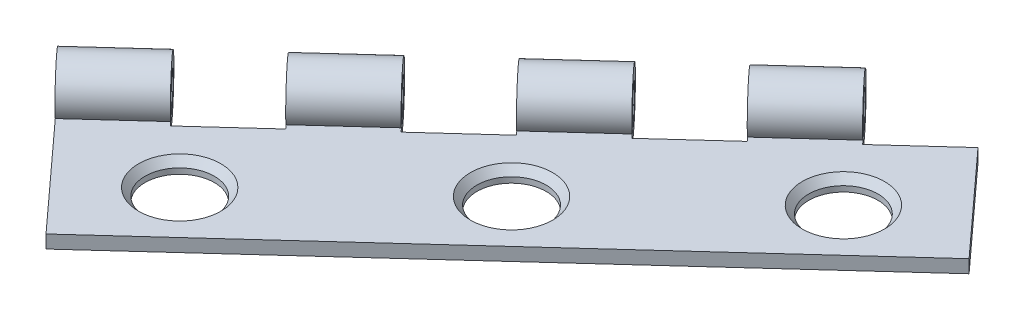
ISO-10303-21;
HEADER;
FILE_DESCRIPTION(('STEP AP214'),'2;1');
FILE_NAME('part.step','',(''),(''),'','','');
FILE_SCHEMA(('AUTOMOTIVE_DESIGN { 1 0 10303 214 1 1 1 1 }'));
ENDSEC;
DATA;
#1=APPLICATION_CONTEXT('core data for automotive mechanical design processes');
#2=APPLICATION_PROTOCOL_DEFINITION('international standard','automotive_design',2000,#1);
#3=PRODUCT_CONTEXT('',#1,'mechanical');
#4=PRODUCT('Part','Part','',(#3));
#5=PRODUCT_RELATED_PRODUCT_CATEGORY('part','',(#4));
#6=PRODUCT_DEFINITION_FORMATION('','',#4);
#7=PRODUCT_DEFINITION_CONTEXT('part definition',#1,'design');
#8=PRODUCT_DEFINITION('design','',#6,#7);
#9=PRODUCT_DEFINITION_SHAPE('','',#8);
#10=(LENGTH_UNIT() NAMED_UNIT(*) SI_UNIT(.MILLI.,.METRE.));
#11=(NAMED_UNIT(*) PLANE_ANGLE_UNIT() SI_UNIT($,.RADIAN.));
#12=(NAMED_UNIT(*) SI_UNIT($,.STERADIAN.) SOLID_ANGLE_UNIT());
#13=UNCERTAINTY_MEASURE_WITH_UNIT(LENGTH_MEASURE(1.E-05),#10,'distance_accuracy_value','');
#14=(GEOMETRIC_REPRESENTATION_CONTEXT(3) GLOBAL_UNCERTAINTY_ASSIGNED_CONTEXT((#13)) GLOBAL_UNIT_ASSIGNED_CONTEXT((#10,
#11,#12)) REPRESENTATION_CONTEXT('',''));
#15=CARTESIAN_POINT('',(0.,0.,0.));
#16=DIRECTION('',(0.,0.,1.));
#17=DIRECTION('',(1.,0.,0.));
#18=AXIS2_PLACEMENT_3D('',#15,#16,#17);
#19=CARTESIAN_POINT('',(-91.6637022397042,14.8082,-282.552746295608));
#20=DIRECTION('',(-0.739139866909712,0.,0.673551970633813));
#21=DIRECTION('',(0.673551970633813,0.,0.739139866909712));
#22=AXIS2_PLACEMENT_3D('',#19,#20,#21);
#23=CYLINDRICAL_SURFACE('',#22,1.0922);
#24=DIRECTION('',(-0.739139866909712,0.,0.673551970633813));
#25=VECTOR('',#24,1.);
#26=CARTESIAN_POINT('',(-91.0105034738831,14.3057826741851,-281.835941550192));
#27=LINE('',#26,#25);
#28=CARTESIAN_POINT('',(-105.091117938513,14.3057826741851,-269.004776509618));
#29=VERTEX_POINT('',#28);
#30=CARTESIAN_POINT('',(-109.78465609339,14.3057826741851,-264.727721496093));
#31=VERTEX_POINT('',#30);
#32=EDGE_CURVE('E384',#29,#31,#27,.T.);
#33=ORIENTED_EDGE('',*,*,#32,.T.);
#34=CARTESIAN_POINT('',(-110.437854859211,14.8082,-265.444526241509));
#35=DIRECTION('',(0.739139866909712,0.,-0.673551970633813));
#36=DIRECTION('',(-0.673551970633813,0.,-0.739139866909712));
#37=AXIS2_PLACEMENT_3D('',#34,#35,#36);
#38=CIRCLE('',#37,1.0922);
#39=CARTESIAN_POINT('',(-110.437854859211,13.716,-265.444526241509));
#40=VERTEX_POINT('',#39);
#41=EDGE_CURVE('E316',#31,#40,#38,.F.);
#42=ORIENTED_EDGE('',*,*,#41,.T.);
#43=DIRECTION('',(-0.739139866909712,0.,0.673551970633813));
#44=VECTOR('',#43,1.);
#45=CARTESIAN_POINT('',(-91.6637022397042,13.716,-282.552746295608));
#46=LINE('',#45,#44);
#47=CARTESIAN_POINT('',(-105.744316704334,13.716,-269.721581255034));
#48=VERTEX_POINT('',#47);
#49=EDGE_CURVE('E403',#48,#40,#46,.T.);
#50=ORIENTED_EDGE('',*,*,#49,.F.);
#51=CARTESIAN_POINT('',(-105.744316704334,14.8082,-269.721581255034));
#52=DIRECTION('',(-0.739139866909712,0.,0.673551970633813));
#53=DIRECTION('',(0.673551970633813,0.,0.739139866909712));
#54=AXIS2_PLACEMENT_3D('',#51,#52,#53);
#55=CIRCLE('',#54,1.0922);
#56=EDGE_CURVE('E280',#48,#29,#55,.F.);
#57=ORIENTED_EDGE('',*,*,#56,.T.);
#58=EDGE_LOOP('',(#33,#42,#50,#57));
#59=FACE_BOUND('',#58,.T.);
#60=ADVANCED_FACE('F41',(#59),#23,.F.);
#61=CARTESIAN_POINT('',(-95.7040416287597,14.3057826741851,-277.558886536667));
#62=VERTEX_POINT('',#61);
#63=CARTESIAN_POINT('',(-100.397579783636,14.3057826741851,-273.281831523143));
#64=VERTEX_POINT('',#63);
#65=EDGE_CURVE('E482',#62,#64,#27,.T.);
#66=ORIENTED_EDGE('',*,*,#65,.T.);
#67=CARTESIAN_POINT('',(-101.050778549457,14.8082,-273.998636268559));
#68=DIRECTION('',(0.739139866909712,0.,-0.673551970633813));
#69=DIRECTION('',(-0.673551970633813,0.,-0.739139866909712));
#70=AXIS2_PLACEMENT_3D('',#67,#68,#69);
#71=CIRCLE('',#70,1.0922);
#72=CARTESIAN_POINT('',(-101.050778549457,13.716,-273.998636268559));
#73=VERTEX_POINT('',#72);
#74=EDGE_CURVE('E294',#64,#73,#71,.F.);
#75=ORIENTED_EDGE('',*,*,#74,.T.);
#76=CARTESIAN_POINT('',(-96.3572403945808,13.716,-278.275691282083));
#77=VERTEX_POINT('',#76);
#78=EDGE_CURVE('E408',#77,#73,#46,.T.);
#79=ORIENTED_EDGE('',*,*,#78,.F.);
#80=CARTESIAN_POINT('',(-96.3572403945808,14.8082,-278.275691282083));
#81=DIRECTION('',(-0.739139866909712,0.,0.673551970633813));
#82=DIRECTION('',(0.673551970633813,0.,0.739139866909712));
#83=AXIS2_PLACEMENT_3D('',#80,#81,#82);
#84=CIRCLE('',#83,1.0922);
#85=EDGE_CURVE('E269',#77,#62,#84,.F.);
#86=ORIENTED_EDGE('',*,*,#85,.T.);
#87=EDGE_LOOP('',(#66,#75,#79,#86));
#88=FACE_BOUND('',#87,.T.);
#89=ADVANCED_FACE('F508',(#88),#23,.F.);
#90=CARTESIAN_POINT('',(-91.6637022397042,14.8082000000001,-282.552746295608));
#91=DIRECTION('',(-0.739139866909712,0.,0.673551970633813));
#92=DIRECTION('',(0.673551970633813,0.,0.739139866909712));
#93=AXIS2_PLACEMENT_3D('',#90,#91,#92);
#94=CYLINDRICAL_SURFACE('',#93,2.10820000000008);
#95=CARTESIAN_POINT('',(-110.437854859211,14.8082000000001,-265.444526241509));
#96=DIRECTION('',(0.739139866909712,0.,-0.673551970633813));
#97=DIRECTION('',(-0.673551970633813,0.,-0.739139866909712));
#98=AXIS2_PLACEMENT_3D('',#95,#96,#97);
#99=CIRCLE('',#98,2.10820000000008);
#100=CARTESIAN_POINT('',(-110.437854859211,12.7,-265.444526241509));
#101=VERTEX_POINT('',#100);
#102=CARTESIAN_POINT('',(-109.177029334486,13.8384177199387,-264.060926384078));
#103=VERTEX_POINT('',#102);
#104=EDGE_CURVE('E230',#101,#103,#99,.T.);
#105=ORIENTED_EDGE('',*,*,#104,.T.);
#106=DIRECTION('',(-0.739139866909712,0.,0.673551970633813));
#107=VECTOR('',#106,1.);
#108=CARTESIAN_POINT('',(-90.4028767149797,13.8384177199387,-281.169146438177));
#109=LINE('',#108,#107);
#110=CARTESIAN_POINT('',(-104.48349117961,13.8384177199387,-268.337981397603));
#111=VERTEX_POINT('',#110);
#112=EDGE_CURVE('E387',#111,#103,#109,.T.);
#113=ORIENTED_EDGE('',*,*,#112,.F.);
#114=CARTESIAN_POINT('',(-105.744316704334,14.8082000000001,-269.721581255034));
#115=DIRECTION('',(-0.739139866909712,0.,0.673551970633813));
#116=DIRECTION('',(0.673551970633813,0.,0.739139866909712));
#117=AXIS2_PLACEMENT_3D('',#114,#115,#116);
#118=CIRCLE('',#117,2.10820000000008);
#119=CARTESIAN_POINT('',(-105.744316704334,12.7,-269.721581255034));
#120=VERTEX_POINT('',#119);
#121=EDGE_CURVE('E286',#111,#120,#118,.T.);
#122=ORIENTED_EDGE('',*,*,#121,.T.);
#123=DIRECTION('',(-0.739139866909712,0.,0.673551970633813));
#124=VECTOR('',#123,1.);
#125=CARTESIAN_POINT('',(-91.6637022397042,12.7,-282.552746295608));
#126=LINE('',#125,#124);
#127=EDGE_CURVE('E391',#120,#101,#126,.T.);
#128=ORIENTED_EDGE('',*,*,#127,.T.);
#129=EDGE_LOOP('',(#105,#113,#122,#128));
#130=FACE_BOUND('',#129,.T.);
#131=ADVANCED_FACE('F526',(#130),#94,.T.);
#132=CARTESIAN_POINT('',(-101.050778549457,14.8082000000001,-273.998636268559));
#133=DIRECTION('',(0.739139866909712,0.,-0.673551970633813));
#134=DIRECTION('',(-0.673551970633813,0.,-0.739139866909712));
#135=AXIS2_PLACEMENT_3D('',#132,#133,#134);
#136=CIRCLE('',#135,2.10820000000008);
#137=CARTESIAN_POINT('',(-101.050778549457,12.7,-273.998636268559));
#138=VERTEX_POINT('',#137);
#139=CARTESIAN_POINT('',(-99.789953024733,13.8384177199387,-272.615036411128));
#140=VERTEX_POINT('',#139);
#141=EDGE_CURVE('E300',#138,#140,#136,.T.);
#142=ORIENTED_EDGE('',*,*,#141,.T.);
#143=CARTESIAN_POINT('',(-95.0964148698564,13.8384177199387,-276.892091424652));
#144=VERTEX_POINT('',#143);
#145=EDGE_CURVE('E490',#144,#140,#109,.T.);
#146=ORIENTED_EDGE('',*,*,#145,.F.);
#147=CARTESIAN_POINT('',(-96.3572403945808,14.8082000000001,-278.275691282083));
#148=DIRECTION('',(-0.739139866909712,0.,0.673551970633813));
#149=DIRECTION('',(0.673551970633813,0.,0.739139866909712));
#150=AXIS2_PLACEMENT_3D('',#147,#148,#149);
#151=CIRCLE('',#150,2.10820000000008);
#152=CARTESIAN_POINT('',(-96.3572403945808,12.7,-278.275691282083));
#153=VERTEX_POINT('',#152);
#154=EDGE_CURVE('E275',#144,#153,#151,.T.);
#155=ORIENTED_EDGE('',*,*,#154,.T.);
#156=EDGE_CURVE('E397',#153,#138,#126,.T.);
#157=ORIENTED_EDGE('',*,*,#156,.T.);
#158=EDGE_LOOP('',(#142,#146,#155,#157));
#159=FACE_BOUND('',#158,.T.);
#160=ADVANCED_FACE('F528',(#159),#94,.T.);
#161=CARTESIAN_POINT('',(-113.870567489363,13.8384177199387,-259.783871370554));
#162=VERTEX_POINT('',#161);
#163=CARTESIAN_POINT('',(-118.56410564424,13.8384177199387,-255.506816357029));
#164=VERTEX_POINT('',#163);
#165=EDGE_CURVE('E385',#162,#164,#109,.T.);
#166=ORIENTED_EDGE('',*,*,#165,.F.);
#167=CARTESIAN_POINT('',(-115.131393014087,14.8082000000001,-261.167471227984));
#168=DIRECTION('',(-0.739139866909712,0.,0.673551970633813));
#169=DIRECTION('',(0.673551970633813,0.,0.739139866909712));
#170=AXIS2_PLACEMENT_3D('',#167,#168,#169);
#171=CIRCLE('',#170,2.10820000000008);
#172=CARTESIAN_POINT('',(-115.131393014087,12.7,-261.167471227984));
#173=VERTEX_POINT('',#172);
#174=EDGE_CURVE('E311',#162,#173,#171,.T.);
#175=ORIENTED_EDGE('',*,*,#174,.T.);
#176=CARTESIAN_POINT('',(-119.824931168964,12.7,-256.89041621446));
#177=VERTEX_POINT('',#176);
#178=EDGE_CURVE('E389',#173,#177,#126,.T.);
#179=ORIENTED_EDGE('',*,*,#178,.T.);
#180=CARTESIAN_POINT('',(-119.824931168964,14.8082000000001,-256.89041621446));
#181=DIRECTION('',(0.739139866909712,0.,-0.673551970633813));
#182=DIRECTION('',(-0.673551970633813,0.,-0.739139866909712));
#183=AXIS2_PLACEMENT_3D('',#180,#181,#182);
#184=CIRCLE('',#183,2.10820000000008);
#185=EDGE_CURVE('E347',#177,#164,#184,.T.);
#186=ORIENTED_EDGE('',*,*,#185,.T.);
#187=EDGE_LOOP('',(#166,#175,#179,#186));
#188=FACE_BOUND('',#187,.T.);
#189=ADVANCED_FACE('F578',(#188),#94,.T.);
#190=CARTESIAN_POINT('',(-91.0105034738831,14.3057826741851,-281.835941550192));
#191=DIRECTION('',(0.309837190883727,0.887916388995925,0.340007942992099));
#192=DIRECTION('',(0.598057833566265,-0.460004876226804,0.6562944015894));
#193=AXIS2_PLACEMENT_3D('',#190,#191,#192);
#194=PLANE('',#193);
#195=ORIENTED_EDGE('',*,*,#112,.T.);
#196=DIRECTION('',(-0.598057833566265,0.460004876226804,-0.6562944015894));
#197=VECTOR('',#196,1.);
#198=CARTESIAN_POINT('',(-109.78465609339,14.3057826741851,-264.727721496093));
#199=LINE('',#198,#197);
#200=EDGE_CURVE('E319',#103,#31,#199,.T.);
#201=ORIENTED_EDGE('',*,*,#200,.T.);
#202=ORIENTED_EDGE('',*,*,#32,.F.);
#203=DIRECTION('',(0.598057833566265,-0.460004876226804,0.6562944015894));
#204=VECTOR('',#203,1.);
#205=CARTESIAN_POINT('',(-105.091117938513,14.3057826741851,-269.004776509618));
#206=LINE('',#205,#204);
#207=EDGE_CURVE('E283',#29,#111,#206,.T.);
#208=ORIENTED_EDGE('',*,*,#207,.T.);
#209=EDGE_LOOP('',(#195,#201,#202,#208));
#210=FACE_BOUND('',#209,.T.);
#211=ADVANCED_FACE('F523',(#210),#194,.F.);
#212=ORIENTED_EDGE('',*,*,#145,.T.);
#213=DIRECTION('',(-0.598057833566265,0.460004876226804,-0.6562944015894));
#214=VECTOR('',#213,1.);
#215=CARTESIAN_POINT('',(-100.397579783636,14.3057826741851,-273.281831523143));
#216=LINE('',#215,#214);
#217=EDGE_CURVE('E297',#140,#64,#216,.T.);
#218=ORIENTED_EDGE('',*,*,#217,.T.);
#219=ORIENTED_EDGE('',*,*,#65,.F.);
#220=DIRECTION('',(0.598057833566265,-0.460004876226804,0.6562944015894));
#221=VECTOR('',#220,1.);
#222=CARTESIAN_POINT('',(-95.7040416287597,14.3057826741851,-277.558886536667));
#223=LINE('',#222,#221);
#224=EDGE_CURVE('E272',#62,#144,#223,.T.);
#225=ORIENTED_EDGE('',*,*,#224,.T.);
#226=EDGE_LOOP('',(#212,#218,#219,#225));
#227=FACE_BOUND('',#226,.T.);
#228=ADVANCED_FACE('F516',(#227),#194,.F.);
#229=CARTESIAN_POINT('',(-115.131393014087,13.716,-261.167471227984));
#230=VERTEX_POINT('',#229);
#231=CARTESIAN_POINT('',(-119.824931168964,13.716,-256.89041621446));
#232=VERTEX_POINT('',#231);
#233=EDGE_CURVE('E401',#230,#232,#46,.T.);
#234=ORIENTED_EDGE('',*,*,#233,.F.);
#235=CARTESIAN_POINT('',(-115.131393014087,14.8082,-261.167471227984));
#236=DIRECTION('',(-0.739139866909712,0.,0.673551970633813));
#237=DIRECTION('',(0.673551970633813,0.,0.739139866909712));
#238=AXIS2_PLACEMENT_3D('',#235,#236,#237);
#239=CIRCLE('',#238,1.0922);
#240=CARTESIAN_POINT('',(-114.478194248266,14.3057826741851,-260.450666482568));
#241=VERTEX_POINT('',#240);
#242=EDGE_CURVE('E305',#230,#241,#239,.F.);
#243=ORIENTED_EDGE('',*,*,#242,.T.);
#244=CARTESIAN_POINT('',(-119.171732403143,14.3057826741851,-256.173611469044));
#245=VERTEX_POINT('',#244);
#246=EDGE_CURVE('E382',#241,#245,#27,.T.);
#247=ORIENTED_EDGE('',*,*,#246,.T.);
#248=CARTESIAN_POINT('',(-119.824931168964,14.8082,-256.89041621446));
#249=DIRECTION('',(0.739139866909712,0.,-0.673551970633813));
#250=DIRECTION('',(-0.673551970633813,0.,-0.739139866909712));
#251=AXIS2_PLACEMENT_3D('',#248,#249,#250);
#252=CIRCLE('',#251,1.0922);
#253=EDGE_CURVE('E346',#245,#232,#252,.F.);
#254=ORIENTED_EDGE('',*,*,#253,.T.);
#255=EDGE_LOOP('',(#234,#243,#247,#254));
#256=FACE_BOUND('',#255,.T.);
#257=ADVANCED_FACE('F547',(#256),#23,.F.);
#258=ORIENTED_EDGE('',*,*,#246,.F.);
#259=DIRECTION('',(0.598057833566265,-0.460004876226804,0.6562944015894));
#260=VECTOR('',#259,1.);
#261=CARTESIAN_POINT('',(-114.478194248266,14.3057826741851,-260.450666482568));
#262=LINE('',#261,#260);
#263=EDGE_CURVE('E308',#241,#162,#262,.T.);
#264=ORIENTED_EDGE('',*,*,#263,.T.);
#265=ORIENTED_EDGE('',*,*,#165,.T.);
#266=DIRECTION('',(-0.598057833566265,0.460004876226804,-0.6562944015894));
#267=VECTOR('',#266,1.);
#268=CARTESIAN_POINT('',(-119.171732403143,14.3057826741851,-256.173611469044));
#269=LINE('',#268,#267);
#270=EDGE_CURVE('E407',#164,#245,#269,.T.);
#271=ORIENTED_EDGE('',*,*,#270,.T.);
#272=EDGE_LOOP('',(#258,#264,#265,#271));
#273=FACE_BOUND('',#272,.T.);
#274=ADVANCED_FACE('F549',(#273),#194,.F.);
#275=CARTESIAN_POINT('',(-124.518469323841,13.716,-252.613361200935));
#276=VERTEX_POINT('',#275);
#277=CARTESIAN_POINT('',(-129.212007478718,13.716,-248.33630618741));
#278=VERTEX_POINT('',#277);
#279=EDGE_CURVE('E400',#276,#278,#46,.T.);
#280=ORIENTED_EDGE('',*,*,#279,.F.);
#281=CARTESIAN_POINT('',(-124.518469323841,14.8082,-252.613361200935));
#282=DIRECTION('',(-0.739139866909712,0.,0.673551970633813));
#283=DIRECTION('',(0.673551970633813,0.,0.739139866909712));
#284=AXIS2_PLACEMENT_3D('',#281,#282,#283);
#285=CIRCLE('',#284,1.0922);
#286=CARTESIAN_POINT('',(-123.86527055802,14.3057826741851,-251.896556455519));
#287=VERTEX_POINT('',#286);
#288=EDGE_CURVE('E336',#276,#287,#285,.F.);
#289=ORIENTED_EDGE('',*,*,#288,.T.);
#290=CARTESIAN_POINT('',(-128.558808712896,14.3057826741851,-247.619501441994));
#291=VERTEX_POINT('',#290);
#292=EDGE_CURVE('E367',#287,#291,#27,.T.);
#293=ORIENTED_EDGE('',*,*,#292,.T.);
#294=CARTESIAN_POINT('',(-129.212007478718,14.8082,-248.33630618741));
#295=DIRECTION('',(-0.739139866909712,0.,0.673551970633813));
#296=DIRECTION('',(0.673551970633813,0.,0.739139866909712));
#297=AXIS2_PLACEMENT_3D('',#294,#295,#296);
#298=CIRCLE('',#297,1.0922);
#299=EDGE_CURVE('E358',#291,#278,#298,.T.);
#300=ORIENTED_EDGE('',*,*,#299,.T.);
#301=EDGE_LOOP('',(#280,#289,#293,#300));
#302=FACE_BOUND('',#301,.T.);
#303=ADVANCED_FACE('F43',(#302),#23,.F.);
#304=CARTESIAN_POINT('',(-83.1095922126547,13.716,-273.165669985855));
#305=DIRECTION('',(0.,-1.,0.));
#306=DIRECTION('',(-0.673551970633813,0.,-0.739139866909712));
#307=AXIS2_PLACEMENT_3D('',#304,#305,#306);
#308=PLANE('',#307);
#309=CARTESIAN_POINT('',(-91.5929203588796,13.716,-271.87841376681));
#310=DIRECTION('',(0.,1.,0.));
#311=DIRECTION('',(0.673551970633813,0.,0.739139866909712));
#312=AXIS2_PLACEMENT_3D('',#309,#310,#311);
#313=CIRCLE('',#312,3.2004);
#314=CARTESIAN_POINT('',(-89.4372846320632,13.716,-269.512870536752));
#315=VERTEX_POINT('',#314);
#316=EDGE_CURVE('E256',#315,#315,#313,.T.);
#317=ORIENTED_EDGE('',*,*,#316,.F.);
#318=EDGE_LOOP('',(#317));
#319=FACE_BOUND('',#318,.T.);
#320=CARTESIAN_POINT('',(-105.091536092305,13.716,-259.577603547913));
#321=DIRECTION('',(0.,1.,0.));
#322=DIRECTION('',(0.673551970633813,0.,0.739139866909712));
#323=AXIS2_PLACEMENT_3D('',#320,#321,#322);
#324=CIRCLE('',#323,3.2004);
#325=CARTESIAN_POINT('',(-102.935900365488,13.716,-257.212060317855));
#326=VERTEX_POINT('',#325);
#327=EDGE_CURVE('E425',#326,#326,#324,.T.);
#328=ORIENTED_EDGE('',*,*,#327,.F.);
#329=EDGE_LOOP('',(#328));
#330=FACE_BOUND('',#329,.T.);
#331=CARTESIAN_POINT('',(-118.59015182573,13.716,-247.276793329016));
#332=DIRECTION('',(0.,1.,0.));
#333=DIRECTION('',(0.673551970633813,0.,0.739139866909712));
#334=AXIS2_PLACEMENT_3D('',#331,#332,#333);
#335=CIRCLE('',#334,3.2004);
#336=CARTESIAN_POINT('',(-116.434516098914,13.716,-244.911250098958));
#337=VERTEX_POINT('',#336);
#338=EDGE_CURVE('E421',#337,#337,#335,.T.);
#339=ORIENTED_EDGE('',*,*,#338,.F.);
#340=EDGE_LOOP('',(#339));
#341=FACE_BOUND('',#340,.T.);
#342=ORIENTED_EDGE('',*,*,#49,.T.);
#343=DIRECTION('',(0.673551970633813,0.,0.739139866909712));
#344=VECTOR('',#343,1.);
#345=CARTESIAN_POINT('',(-101.883744832161,13.716,-256.057449931756));
#346=LINE('',#345,#344);
#347=CARTESIAN_POINT('',(-109.017872594721,13.716,-263.88627157409));
#348=VERTEX_POINT('',#347);
#349=EDGE_CURVE('E314',#40,#348,#346,.T.);
#350=ORIENTED_EDGE('',*,*,#349,.T.);
#351=DIRECTION('',(-0.739139866909712,0.,0.673551970633813));
#352=VECTOR('',#351,1.);
#353=CARTESIAN_POINT('',(-90.2437199752138,13.716,-280.994491628189));
#354=LINE('',#353,#352);
#355=CARTESIAN_POINT('',(-113.711410749597,13.716,-259.609216560565));
#356=VERTEX_POINT('',#355);
#357=EDGE_CURVE('E220',#348,#356,#354,.T.);
#358=ORIENTED_EDGE('',*,*,#357,.T.);
#359=DIRECTION('',(-0.673551970633813,0.,-0.739139866909712));
#360=VECTOR('',#359,1.);
#361=CARTESIAN_POINT('',(-106.577282987038,13.716,-251.780394918231));
#362=LINE('',#361,#360);
#363=EDGE_CURVE('E302',#356,#230,#362,.T.);
#364=ORIENTED_EDGE('',*,*,#363,.T.);
#365=ORIENTED_EDGE('',*,*,#233,.T.);
#366=DIRECTION('',(0.673551970633813,0.,0.739139866909712));
#367=VECTOR('',#366,1.);
#368=CARTESIAN_POINT('',(-111.270821141915,13.716,-247.503339904706));
#369=LINE('',#368,#367);
#370=CARTESIAN_POINT('',(-118.404948904474,13.716,-255.33216154704));
#371=VERTEX_POINT('',#370);
#372=EDGE_CURVE('E350',#232,#371,#369,.T.);
#373=ORIENTED_EDGE('',*,*,#372,.T.);
#374=DIRECTION('',(-0.739139866909712,0.,0.673551970633813));
#375=VECTOR('',#374,1.);
#376=CARTESIAN_POINT('',(-90.2437199752138,13.716,-280.994491628189));
#377=LINE('',#376,#375);
#378=CARTESIAN_POINT('',(-123.098487059351,13.716,-251.055106533516));
#379=VERTEX_POINT('',#378);
#380=EDGE_CURVE('E355',#371,#379,#377,.T.);
#381=ORIENTED_EDGE('',*,*,#380,.T.);
#382=DIRECTION('',(-0.673551970633813,0.,-0.739139866909712));
#383=VECTOR('',#382,1.);
#384=CARTESIAN_POINT('',(-115.964359296791,13.716,-243.226284891182));
#385=LINE('',#384,#383);
#386=EDGE_CURVE('E341',#379,#276,#385,.T.);
#387=ORIENTED_EDGE('',*,*,#386,.T.);
#388=ORIENTED_EDGE('',*,*,#279,.T.);
#389=DIRECTION('',(0.673551970633813,0.,0.739139866909712));
#390=VECTOR('',#389,1.);
#391=CARTESIAN_POINT('',(-120.657897451668,13.716,-238.949229877657));
#392=LINE('',#391,#390);
#393=CARTESIAN_POINT('',(-120.657897451668,13.716,-238.949229877657));
#394=VERTEX_POINT('',#393);
#395=EDGE_CURVE('E370',#278,#394,#392,.T.);
#396=ORIENTED_EDGE('',*,*,#395,.T.);
#397=DIRECTION('',(-0.739139866909712,0.,0.673551970633813));
#398=VECTOR('',#397,1.);
#399=CARTESIAN_POINT('',(-83.1095922126547,13.716,-273.165669985855));
#400=LINE('',#399,#398);
#401=CARTESIAN_POINT('',(-83.1095922126547,13.716,-273.165669985855));
#402=VERTEX_POINT('',#401);
#403=EDGE_CURVE('E396',#402,#394,#400,.T.);
#404=ORIENTED_EDGE('',*,*,#403,.F.);
#405=DIRECTION('',(0.673551970633813,0.,0.739139866909712));
#406=VECTOR('',#405,1.);
#407=CARTESIAN_POINT('',(-83.1095922126547,13.716,-273.165669985855));
#408=LINE('',#407,#406);
#409=CARTESIAN_POINT('',(-90.2437199752138,13.716,-280.994491628189));
#410=VERTEX_POINT('',#409);
#411=EDGE_CURVE('E359',#410,#402,#408,.T.);
#412=ORIENTED_EDGE('',*,*,#411,.F.);
#413=DIRECTION('',(-0.739139866909712,0.,0.673551970633813));
#414=VECTOR('',#413,1.);
#415=CARTESIAN_POINT('',(-90.2437199752138,13.716,-280.994491628189));
#416=LINE('',#415,#414);
#417=CARTESIAN_POINT('',(-94.9372581300905,13.716,-276.717436614664));
#418=VERTEX_POINT('',#417);
#419=EDGE_CURVE('E223',#410,#418,#416,.T.);
#420=ORIENTED_EDGE('',*,*,#419,.T.);
#421=DIRECTION('',(-0.673551970633813,0.,-0.739139866909712));
#422=VECTOR('',#421,1.);
#423=CARTESIAN_POINT('',(-87.8031303675314,13.716,-268.88861497233));
#424=LINE('',#423,#422);
#425=EDGE_CURVE('E266',#418,#77,#424,.T.);
#426=ORIENTED_EDGE('',*,*,#425,.T.);
#427=ORIENTED_EDGE('',*,*,#78,.T.);
#428=DIRECTION('',(0.673551970633813,0.,0.739139866909712));
#429=VECTOR('',#428,1.);
#430=CARTESIAN_POINT('',(-92.4966685224081,13.716,-264.611559958805));
#431=LINE('',#430,#429);
#432=CARTESIAN_POINT('',(-99.6307962849672,13.716,-272.440381601139));
#433=VERTEX_POINT('',#432);
#434=EDGE_CURVE('E291',#73,#433,#431,.T.);
#435=ORIENTED_EDGE('',*,*,#434,.T.);
#436=DIRECTION('',(-0.739139866909712,0.,0.673551970633813));
#437=VECTOR('',#436,1.);
#438=CARTESIAN_POINT('',(-90.2437199752138,13.716,-280.994491628189));
#439=LINE('',#438,#437);
#440=CARTESIAN_POINT('',(-104.324334439844,13.716,-268.163326587615));
#441=VERTEX_POINT('',#440);
#442=EDGE_CURVE('E288',#433,#441,#439,.T.);
#443=ORIENTED_EDGE('',*,*,#442,.T.);
#444=DIRECTION('',(-0.673551970633813,0.,-0.739139866909712));
#445=VECTOR('',#444,1.);
#446=CARTESIAN_POINT('',(-97.1902066772847,13.716,-260.334504945281));
#447=LINE('',#446,#445);
#448=EDGE_CURVE('E277',#441,#48,#447,.T.);
#449=ORIENTED_EDGE('',*,*,#448,.T.);
#450=EDGE_LOOP('',(#342,#350,#358,#364,#365,#373,#381,#387,#388,#396,#404,#412,#420,#426,#427,
#435,#443,#449));
#451=FACE_BOUND('',#450,.T.);
#452=ADVANCED_FACE('F458',(#319,#330,#341,#451),#308,.F.);
#453=CARTESIAN_POINT('',(-83.1095922126547,12.7,-273.165669985855));
#454=DIRECTION('',(-0.673551970633813,0.,-0.739139866909712));
#455=DIRECTION('',(-0.739139866909712,0.,0.673551970633813));
#456=AXIS2_PLACEMENT_3D('',#453,#454,#455);
#457=PLANE('',#456);
#458=DIRECTION('',(0.,-1.,0.));
#459=VECTOR('',#458,1.);
#460=CARTESIAN_POINT('',(-120.657897451668,12.7,-238.949229877657));
#461=LINE('',#460,#459);
#462=CARTESIAN_POINT('',(-120.657897451668,12.7,-238.949229877657));
#463=VERTEX_POINT('',#462);
#464=EDGE_CURVE('E372',#394,#463,#461,.T.);
#465=ORIENTED_EDGE('',*,*,#464,.T.);
#466=DIRECTION('',(-0.739139866909712,0.,0.673551970633813));
#467=VECTOR('',#466,1.);
#468=CARTESIAN_POINT('',(-83.1095922126547,12.7,-273.165669985855));
#469=LINE('',#468,#467);
#470=CARTESIAN_POINT('',(-83.1095922126547,12.7,-273.165669985855));
#471=VERTEX_POINT('',#470);
#472=EDGE_CURVE('E393',#471,#463,#469,.T.);
#473=ORIENTED_EDGE('',*,*,#472,.F.);
#474=DIRECTION('',(0.,-1.,0.));
#475=VECTOR('',#474,1.);
#476=CARTESIAN_POINT('',(-83.1095922126547,12.7,-273.165669985855));
#477=LINE('',#476,#475);
#478=EDGE_CURVE('E361',#402,#471,#477,.T.);
#479=ORIENTED_EDGE('',*,*,#478,.F.);
#480=ORIENTED_EDGE('',*,*,#403,.T.);
#481=EDGE_LOOP('',(#465,#473,#479,#480));
#482=FACE_BOUND('',#481,.T.);
#483=ADVANCED_FACE('F461',(#482),#457,.F.);
#484=CARTESIAN_POINT('',(-91.6637022397042,12.7,-282.552746295608));
#485=DIRECTION('',(0.,1.,0.));
#486=DIRECTION('',(0.673551970633813,0.,0.739139866909712));
#487=AXIS2_PLACEMENT_3D('',#484,#485,#486);
#488=PLANE('',#487);
#489=CARTESIAN_POINT('',(-91.5929203588796,12.7,-271.87841376681));
#490=DIRECTION('',(0.,1.,0.));
#491=DIRECTION('',(0.673551970633813,0.,0.739139866909712));
#492=AXIS2_PLACEMENT_3D('',#489,#490,#491);
#493=CIRCLE('',#492,2.6924);
#494=CARTESIAN_POINT('',(-89.7794490331451,12.7,-269.888353589143));
#495=VERTEX_POINT('',#494);
#496=EDGE_CURVE('E416',#495,#495,#493,.T.);
#497=ORIENTED_EDGE('',*,*,#496,.T.);
#498=EDGE_LOOP('',(#497));
#499=FACE_BOUND('',#498,.T.);
#500=CARTESIAN_POINT('',(-105.091536092305,12.7,-259.577603547913));
#501=DIRECTION('',(0.,1.,0.));
#502=DIRECTION('',(0.673551970633813,0.,0.739139866909712));
#503=AXIS2_PLACEMENT_3D('',#500,#501,#502);
#504=CIRCLE('',#503,2.6924);
#505=CARTESIAN_POINT('',(-103.27806476657,12.7,-257.587543370246));
#506=VERTEX_POINT('',#505);
#507=EDGE_CURVE('E436',#506,#506,#504,.T.);
#508=ORIENTED_EDGE('',*,*,#507,.T.);
#509=EDGE_LOOP('',(#508));
#510=FACE_BOUND('',#509,.T.);
#511=CARTESIAN_POINT('',(-118.59015182573,12.7,-247.276793329016));
#512=DIRECTION('',(0.,1.,0.));
#513=DIRECTION('',(0.673551970633813,0.,0.739139866909712));
#514=AXIS2_PLACEMENT_3D('',#511,#512,#513);
#515=CIRCLE('',#514,2.6924);
#516=CARTESIAN_POINT('',(-116.776680499996,12.7,-245.286733151348));
#517=VERTEX_POINT('',#516);
#518=EDGE_CURVE('E433',#517,#517,#515,.T.);
#519=ORIENTED_EDGE('',*,*,#518,.T.);
#520=EDGE_LOOP('',(#519));
#521=FACE_BOUND('',#520,.T.);
#522=DIRECTION('',(0.739139866909712,0.,-0.673551970633813));
#523=VECTOR('',#522,1.);
#524=CARTESIAN_POINT('',(-109.017872594721,12.7,-263.88627157409));
#525=LINE('',#524,#523);
#526=CARTESIAN_POINT('',(-113.711410749597,12.7,-259.609216560565));
#527=VERTEX_POINT('',#526);
#528=CARTESIAN_POINT('',(-109.017872594721,12.7,-263.88627157409));
#529=VERTEX_POINT('',#528);
#530=EDGE_CURVE('E58',#527,#529,#525,.T.);
#531=ORIENTED_EDGE('',*,*,#530,.T.);
#532=DIRECTION('',(-0.673551970633813,0.,-0.739139866909712));
#533=VECTOR('',#532,1.);
#534=CARTESIAN_POINT('',(-111.857837123701,12.7,-267.002780908928));
#535=LINE('',#534,#533);
#536=EDGE_CURVE('E227',#529,#101,#535,.T.);
#537=ORIENTED_EDGE('',*,*,#536,.T.);
#538=ORIENTED_EDGE('',*,*,#127,.F.);
#539=DIRECTION('',(0.673551970633813,0.,0.739139866909712));
#540=VECTOR('',#539,1.);
#541=CARTESIAN_POINT('',(-105.744316704334,12.7,-269.721581255034));
#542=LINE('',#541,#540);
#543=CARTESIAN_POINT('',(-104.324334439844,12.7,-268.163326587615));
#544=VERTEX_POINT('',#543);
#545=EDGE_CURVE('E50',#120,#544,#542,.T.);
#546=ORIENTED_EDGE('',*,*,#545,.T.);
#547=DIRECTION('',(0.739139866909712,0.,-0.673551970633813));
#548=VECTOR('',#547,1.);
#549=CARTESIAN_POINT('',(-99.6307962849672,12.7,-272.440381601139));
#550=LINE('',#549,#548);
#551=CARTESIAN_POINT('',(-99.6307962849672,12.7,-272.440381601139));
#552=VERTEX_POINT('',#551);
#553=EDGE_CURVE('E66',#544,#552,#550,.T.);
#554=ORIENTED_EDGE('',*,*,#553,.T.);
#555=DIRECTION('',(-0.673551970633813,0.,-0.739139866909712));
#556=VECTOR('',#555,1.);
#557=CARTESIAN_POINT('',(-102.470760813948,12.7,-275.556890935978));
#558=LINE('',#557,#556);
#559=EDGE_CURVE('E243',#552,#138,#558,.T.);
#560=ORIENTED_EDGE('',*,*,#559,.T.);
#561=ORIENTED_EDGE('',*,*,#156,.F.);
#562=DIRECTION('',(0.673551970633813,0.,0.739139866909712));
#563=VECTOR('',#562,1.);
#564=CARTESIAN_POINT('',(-94.9372581300905,12.7,-276.717436614664));
#565=LINE('',#564,#563);
#566=CARTESIAN_POINT('',(-94.9372581300905,12.7,-276.717436614664));
#567=VERTEX_POINT('',#566);
#568=EDGE_CURVE('E252',#153,#567,#565,.T.);
#569=ORIENTED_EDGE('',*,*,#568,.T.);
#570=DIRECTION('',(0.739139866909712,0.,-0.673551970633813));
#571=VECTOR('',#570,1.);
#572=CARTESIAN_POINT('',(-90.2437199752138,12.7,-280.994491628189));
#573=LINE('',#572,#571);
#574=CARTESIAN_POINT('',(-90.2437199752138,12.7,-280.994491628189));
#575=VERTEX_POINT('',#574);
#576=EDGE_CURVE('E255',#567,#575,#573,.T.);
#577=ORIENTED_EDGE('',*,*,#576,.T.);
#578=DIRECTION('',(-0.673551970633813,0.,-0.739139866909712));
#579=VECTOR('',#578,1.);
#580=CARTESIAN_POINT('',(-91.6637022397042,12.7,-282.552746295608));
#581=LINE('',#580,#579);
#582=EDGE_CURVE('E364',#471,#575,#581,.T.);
#583=ORIENTED_EDGE('',*,*,#582,.F.);
#584=ORIENTED_EDGE('',*,*,#472,.T.);
#585=DIRECTION('',(-0.673551970633813,0.,-0.739139866909712));
#586=VECTOR('',#585,1.);
#587=CARTESIAN_POINT('',(-129.212007478718,12.7,-248.33630618741));
#588=LINE('',#587,#586);
#589=CARTESIAN_POINT('',(-129.212007478718,12.7,-248.33630618741));
#590=VERTEX_POINT('',#589);
#591=EDGE_CURVE('E374',#463,#590,#588,.T.);
#592=ORIENTED_EDGE('',*,*,#591,.T.);
#593=CARTESIAN_POINT('',(-124.518469323841,12.7,-252.613361200935));
#594=VERTEX_POINT('',#593);
#595=EDGE_CURVE('E392',#594,#590,#126,.T.);
#596=ORIENTED_EDGE('',*,*,#595,.F.);
#597=DIRECTION('',(0.673551970633813,0.,0.739139866909712));
#598=VECTOR('',#597,1.);
#599=CARTESIAN_POINT('',(-123.098487059351,12.7,-251.055106533516));
#600=LINE('',#599,#598);
#601=CARTESIAN_POINT('',(-123.098487059351,12.7,-251.055106533516));
#602=VERTEX_POINT('',#601);
#603=EDGE_CURVE('E326',#594,#602,#600,.T.);
#604=ORIENTED_EDGE('',*,*,#603,.T.);
#605=DIRECTION('',(0.739139866909712,0.,-0.673551970633813));
#606=VECTOR('',#605,1.);
#607=CARTESIAN_POINT('',(-118.404948904474,12.7,-255.33216154704));
#608=LINE('',#607,#606);
#609=CARTESIAN_POINT('',(-118.404948904474,12.7,-255.33216154704));
#610=VERTEX_POINT('',#609);
#611=EDGE_CURVE('E329',#602,#610,#608,.T.);
#612=ORIENTED_EDGE('',*,*,#611,.T.);
#613=DIRECTION('',(-0.673551970633813,0.,-0.739139866909712));
#614=VECTOR('',#613,1.);
#615=CARTESIAN_POINT('',(-121.244913433454,12.7,-258.448670881879));
#616=LINE('',#615,#614);
#617=EDGE_CURVE('E323',#610,#177,#616,.T.);
#618=ORIENTED_EDGE('',*,*,#617,.T.);
#619=ORIENTED_EDGE('',*,*,#178,.F.);
#620=DIRECTION('',(0.673551970633813,0.,0.739139866909712));
#621=VECTOR('',#620,1.);
#622=CARTESIAN_POINT('',(-115.131393014087,12.7,-261.167471227984));
#623=LINE('',#622,#621);
#624=EDGE_CURVE('E11',#173,#527,#623,.T.);
#625=ORIENTED_EDGE('',*,*,#624,.T.);
#626=EDGE_LOOP('',(#531,#537,#538,#546,#554,#560,#561,#569,#577,#583,#584,#592,#596,#604,#612,
#618,#619,#625));
#627=FACE_BOUND('',#626,.T.);
#628=ADVANCED_FACE('F236',(#499,#510,#521,#627),#488,.F.);
#629=CARTESIAN_POINT('',(-123.257643799116,13.8384177199387,-251.229761343504));
#630=VERTEX_POINT('',#629);
#631=CARTESIAN_POINT('',(-127.951181953993,13.8384177199387,-246.952706329979));
#632=VERTEX_POINT('',#631);
#633=EDGE_CURVE('E388',#630,#632,#109,.T.);
#634=ORIENTED_EDGE('',*,*,#633,.F.);
#635=CARTESIAN_POINT('',(-124.518469323841,14.8082000000001,-252.613361200935));
#636=DIRECTION('',(-0.739139866909712,0.,0.673551970633813));
#637=DIRECTION('',(0.673551970633813,0.,0.739139866909712));
#638=AXIS2_PLACEMENT_3D('',#635,#636,#637);
#639=CIRCLE('',#638,2.10820000000008);
#640=EDGE_CURVE('E339',#630,#594,#639,.T.);
#641=ORIENTED_EDGE('',*,*,#640,.T.);
#642=ORIENTED_EDGE('',*,*,#595,.T.);
#643=CARTESIAN_POINT('',(-129.212007478718,14.8082000000001,-248.33630618741));
#644=DIRECTION('',(0.739139866909712,0.,-0.673551970633813));
#645=DIRECTION('',(0.673551970633813,0.,0.739139866909712));
#646=AXIS2_PLACEMENT_3D('',#643,#644,#645);
#647=CIRCLE('',#646,2.10820000000008);
#648=EDGE_CURVE('E377',#590,#632,#647,.T.);
#649=ORIENTED_EDGE('',*,*,#648,.T.);
#650=EDGE_LOOP('',(#634,#641,#642,#649));
#651=FACE_BOUND('',#650,.T.);
#652=ADVANCED_FACE('F487',(#651),#94,.T.);
#653=ORIENTED_EDGE('',*,*,#292,.F.);
#654=DIRECTION('',(0.598057833566265,-0.460004876226804,0.6562944015894));
#655=VECTOR('',#654,1.);
#656=CARTESIAN_POINT('',(-123.86527055802,14.3057826741851,-251.896556455519));
#657=LINE('',#656,#655);
#658=EDGE_CURVE('E404',#287,#630,#657,.T.);
#659=ORIENTED_EDGE('',*,*,#658,.T.);
#660=ORIENTED_EDGE('',*,*,#633,.T.);
#661=DIRECTION('',(-0.598057833566265,0.460004876226804,-0.6562944015894));
#662=VECTOR('',#661,1.);
#663=CARTESIAN_POINT('',(-128.558808712896,14.3057826741851,-247.619501441994));
#664=LINE('',#663,#662);
#665=EDGE_CURVE('E362',#632,#291,#664,.T.);
#666=ORIENTED_EDGE('',*,*,#665,.T.);
#667=EDGE_LOOP('',(#653,#659,#660,#666));
#668=FACE_BOUND('',#667,.T.);
#669=ADVANCED_FACE('F483',(#668),#194,.F.);
#670=CARTESIAN_POINT('',(-91.6637022397042,14.8082,-282.552746295608));
#671=DIRECTION('',(-0.739139866909712,0.,0.673551970633813));
#672=DIRECTION('',(0.673551970633813,0.,0.739139866909712));
#673=AXIS2_PLACEMENT_3D('',#670,#671,#672);
#674=PLANE('',#673);
#675=ORIENTED_EDGE('',*,*,#582,.T.);
#676=DIRECTION('',(0.,1.,0.));
#677=VECTOR('',#676,1.);
#678=CARTESIAN_POINT('',(-90.2437199752138,12.7,-280.994491628189));
#679=LINE('',#678,#677);
#680=EDGE_CURVE('E246',#575,#410,#679,.T.);
#681=ORIENTED_EDGE('',*,*,#680,.T.);
#682=ORIENTED_EDGE('',*,*,#411,.T.);
#683=ORIENTED_EDGE('',*,*,#478,.T.);
#684=EDGE_LOOP('',(#675,#681,#682,#683));
#685=FACE_BOUND('',#684,.T.);
#686=ADVANCED_FACE('F497',(#685),#674,.F.);
#687=CARTESIAN_POINT('',(-129.212007478718,14.8082,-248.33630618741));
#688=DIRECTION('',(-0.739139866909712,0.,0.673551970633813));
#689=DIRECTION('',(0.673551970633813,0.,0.739139866909712));
#690=AXIS2_PLACEMENT_3D('',#687,#688,#689);
#691=PLANE('',#690);
#692=ORIENTED_EDGE('',*,*,#299,.F.);
#693=ORIENTED_EDGE('',*,*,#665,.F.);
#694=ORIENTED_EDGE('',*,*,#648,.F.);
#695=ORIENTED_EDGE('',*,*,#591,.F.);
#696=ORIENTED_EDGE('',*,*,#464,.F.);
#697=ORIENTED_EDGE('',*,*,#395,.F.);
#698=EDGE_LOOP('',(#692,#693,#694,#695,#696,#697));
#699=FACE_BOUND('',#698,.T.);
#700=ADVANCED_FACE('F477',(#699),#691,.T.);
#701=CARTESIAN_POINT('',(-118.404948904474,12.7,-255.33216154704));
#702=DIRECTION('',(0.673551970633813,0.,0.739139866909712));
#703=DIRECTION('',(0.739139866909712,0.,-0.673551970633813));
#704=AXIS2_PLACEMENT_3D('',#701,#702,#703);
#705=PLANE('',#704);
#706=DIRECTION('',(0.,1.,0.));
#707=VECTOR('',#706,1.);
#708=CARTESIAN_POINT('',(-118.404948904474,12.7,-255.33216154704));
#709=LINE('',#708,#707);
#710=EDGE_CURVE('E333',#610,#371,#709,.T.);
#711=ORIENTED_EDGE('',*,*,#710,.F.);
#712=ORIENTED_EDGE('',*,*,#611,.F.);
#713=DIRECTION('',(0.,1.,0.));
#714=VECTOR('',#713,1.);
#715=CARTESIAN_POINT('',(-123.098487059351,12.7,-251.055106533516));
#716=LINE('',#715,#714);
#717=EDGE_CURVE('E332',#602,#379,#716,.T.);
#718=ORIENTED_EDGE('',*,*,#717,.T.);
#719=ORIENTED_EDGE('',*,*,#380,.F.);
#720=EDGE_LOOP('',(#711,#712,#718,#719));
#721=FACE_BOUND('',#720,.T.);
#722=ADVANCED_FACE('F573',(#721),#705,.F.);
#723=CARTESIAN_POINT('',(-121.244913433454,12.7,-258.448670881879));
#724=DIRECTION('',(0.739139866909712,0.,-0.673551970633813));
#725=DIRECTION('',(-0.673551970633813,0.,-0.739139866909712));
#726=AXIS2_PLACEMENT_3D('',#723,#724,#725);
#727=PLANE('',#726);
#728=ORIENTED_EDGE('',*,*,#253,.F.);
#729=ORIENTED_EDGE('',*,*,#270,.F.);
#730=ORIENTED_EDGE('',*,*,#185,.F.);
#731=ORIENTED_EDGE('',*,*,#617,.F.);
#732=ORIENTED_EDGE('',*,*,#710,.T.);
#733=ORIENTED_EDGE('',*,*,#372,.F.);
#734=EDGE_LOOP('',(#728,#729,#730,#731,#732,#733));
#735=FACE_BOUND('',#734,.T.);
#736=ADVANCED_FACE('F567',(#735),#727,.F.);
#737=CARTESIAN_POINT('',(-123.098487059351,12.7,-251.055106533516));
#738=DIRECTION('',(-0.739139866909712,0.,0.673551970633813));
#739=DIRECTION('',(0.673551970633813,0.,0.739139866909712));
#740=AXIS2_PLACEMENT_3D('',#737,#738,#739);
#741=PLANE('',#740);
#742=ORIENTED_EDGE('',*,*,#640,.F.);
#743=ORIENTED_EDGE('',*,*,#658,.F.);
#744=ORIENTED_EDGE('',*,*,#288,.F.);
#745=ORIENTED_EDGE('',*,*,#386,.F.);
#746=ORIENTED_EDGE('',*,*,#717,.F.);
#747=ORIENTED_EDGE('',*,*,#603,.F.);
#748=EDGE_LOOP('',(#742,#743,#744,#745,#746,#747));
#749=FACE_BOUND('',#748,.T.);
#750=ADVANCED_FACE('F575',(#749),#741,.F.);
#751=CARTESIAN_POINT('',(-94.9372581300905,12.7,-276.717436614664));
#752=DIRECTION('',(-0.739139866909712,0.,0.673551970633813));
#753=DIRECTION('',(0.673551970633813,0.,0.739139866909712));
#754=AXIS2_PLACEMENT_3D('',#751,#752,#753);
#755=PLANE('',#754);
#756=ORIENTED_EDGE('',*,*,#154,.F.);
#757=ORIENTED_EDGE('',*,*,#224,.F.);
#758=ORIENTED_EDGE('',*,*,#85,.F.);
#759=ORIENTED_EDGE('',*,*,#425,.F.);
#760=DIRECTION('',(0.,1.,0.));
#761=VECTOR('',#760,1.);
#762=CARTESIAN_POINT('',(-94.9372581300905,12.7,-276.717436614664));
#763=LINE('',#762,#761);
#764=EDGE_CURVE('E259',#567,#418,#763,.T.);
#765=ORIENTED_EDGE('',*,*,#764,.F.);
#766=ORIENTED_EDGE('',*,*,#568,.F.);
#767=EDGE_LOOP('',(#756,#757,#758,#759,#765,#766));
#768=FACE_BOUND('',#767,.T.);
#769=ADVANCED_FACE('F505',(#768),#755,.F.);
#770=CARTESIAN_POINT('',(-90.2437199752138,12.7,-280.994491628189));
#771=DIRECTION('',(0.673551970633813,0.,0.739139866909712));
#772=DIRECTION('',(0.739139866909712,0.,-0.673551970633813));
#773=AXIS2_PLACEMENT_3D('',#770,#771,#772);
#774=PLANE('',#773);
#775=ORIENTED_EDGE('',*,*,#680,.F.);
#776=ORIENTED_EDGE('',*,*,#576,.F.);
#777=ORIENTED_EDGE('',*,*,#764,.T.);
#778=ORIENTED_EDGE('',*,*,#419,.F.);
#779=EDGE_LOOP('',(#775,#776,#777,#778));
#780=FACE_BOUND('',#779,.T.);
#781=ADVANCED_FACE('F500',(#780),#774,.F.);
#782=CARTESIAN_POINT('',(-102.470760813948,12.7,-275.556890935978));
#783=DIRECTION('',(0.739139866909712,0.,-0.673551970633813));
#784=DIRECTION('',(-0.673551970633813,0.,-0.739139866909712));
#785=AXIS2_PLACEMENT_3D('',#782,#783,#784);
#786=PLANE('',#785);
#787=ORIENTED_EDGE('',*,*,#559,.F.);
#788=DIRECTION('',(0.,1.,0.));
#789=VECTOR('',#788,1.);
#790=CARTESIAN_POINT('',(-99.6307962849672,12.7,-272.440381601139));
#791=LINE('',#790,#789);
#792=EDGE_CURVE('E234',#552,#433,#791,.T.);
#793=ORIENTED_EDGE('',*,*,#792,.T.);
#794=ORIENTED_EDGE('',*,*,#434,.F.);
#795=ORIENTED_EDGE('',*,*,#74,.F.);
#796=ORIENTED_EDGE('',*,*,#217,.F.);
#797=ORIENTED_EDGE('',*,*,#141,.F.);
#798=EDGE_LOOP('',(#787,#793,#794,#795,#796,#797));
#799=FACE_BOUND('',#798,.T.);
#800=ADVANCED_FACE('F513',(#799),#786,.F.);
#801=CARTESIAN_POINT('',(-99.6307962849672,12.7,-272.440381601139));
#802=DIRECTION('',(0.673551970633813,0.,0.739139866909712));
#803=DIRECTION('',(0.739139866909712,0.,-0.673551970633813));
#804=AXIS2_PLACEMENT_3D('',#801,#802,#803);
#805=PLANE('',#804);
#806=ORIENTED_EDGE('',*,*,#792,.F.);
#807=ORIENTED_EDGE('',*,*,#553,.F.);
#808=DIRECTION('',(0.,1.,0.));
#809=VECTOR('',#808,1.);
#810=CARTESIAN_POINT('',(-104.324334439844,12.7,-268.163326587615));
#811=LINE('',#810,#809);
#812=EDGE_CURVE('E248',#544,#441,#811,.T.);
#813=ORIENTED_EDGE('',*,*,#812,.T.);
#814=ORIENTED_EDGE('',*,*,#442,.F.);
#815=EDGE_LOOP('',(#806,#807,#813,#814));
#816=FACE_BOUND('',#815,.T.);
#817=ADVANCED_FACE('F531',(#816),#805,.F.);
#818=CARTESIAN_POINT('',(-104.324334439844,12.7,-268.163326587615));
#819=DIRECTION('',(-0.739139866909712,0.,0.673551970633813));
#820=DIRECTION('',(0.673551970633813,0.,0.739139866909712));
#821=AXIS2_PLACEMENT_3D('',#818,#819,#820);
#822=PLANE('',#821);
#823=ORIENTED_EDGE('',*,*,#121,.F.);
#824=ORIENTED_EDGE('',*,*,#207,.F.);
#825=ORIENTED_EDGE('',*,*,#56,.F.);
#826=ORIENTED_EDGE('',*,*,#448,.F.);
#827=ORIENTED_EDGE('',*,*,#812,.F.);
#828=ORIENTED_EDGE('',*,*,#545,.F.);
#829=EDGE_LOOP('',(#823,#824,#825,#826,#827,#828));
#830=FACE_BOUND('',#829,.T.);
#831=ADVANCED_FACE('F530',(#830),#822,.F.);
#832=CARTESIAN_POINT('',(-111.857837123701,12.7,-267.002780908928));
#833=DIRECTION('',(0.739139866909712,0.,-0.673551970633813));
#834=DIRECTION('',(-0.673551970633813,0.,-0.739139866909712));
#835=AXIS2_PLACEMENT_3D('',#832,#833,#834);
#836=PLANE('',#835);
#837=ORIENTED_EDGE('',*,*,#536,.F.);
#838=DIRECTION('',(0.,1.,0.));
#839=VECTOR('',#838,1.);
#840=CARTESIAN_POINT('',(-109.017872594721,12.7,-263.88627157409));
#841=LINE('',#840,#839);
#842=EDGE_CURVE('E216',#529,#348,#841,.T.);
#843=ORIENTED_EDGE('',*,*,#842,.T.);
#844=ORIENTED_EDGE('',*,*,#349,.F.);
#845=ORIENTED_EDGE('',*,*,#41,.F.);
#846=ORIENTED_EDGE('',*,*,#200,.F.);
#847=ORIENTED_EDGE('',*,*,#104,.F.);
#848=EDGE_LOOP('',(#837,#843,#844,#845,#846,#847));
#849=FACE_BOUND('',#848,.T.);
#850=ADVANCED_FACE('F228',(#849),#836,.F.);
#851=CARTESIAN_POINT('',(-109.017872594721,12.7,-263.88627157409));
#852=DIRECTION('',(0.673551970633813,0.,0.739139866909712));
#853=DIRECTION('',(0.739139866909712,0.,-0.673551970633813));
#854=AXIS2_PLACEMENT_3D('',#851,#852,#853);
#855=PLANE('',#854);
#856=ORIENTED_EDGE('',*,*,#842,.F.);
#857=ORIENTED_EDGE('',*,*,#530,.F.);
#858=DIRECTION('',(0.,1.,0.));
#859=VECTOR('',#858,1.);
#860=CARTESIAN_POINT('',(-113.711410749597,12.7,-259.609216560565));
#861=LINE('',#860,#859);
#862=EDGE_CURVE('E224',#527,#356,#861,.T.);
#863=ORIENTED_EDGE('',*,*,#862,.T.);
#864=ORIENTED_EDGE('',*,*,#357,.F.);
#865=EDGE_LOOP('',(#856,#857,#863,#864));
#866=FACE_BOUND('',#865,.T.);
#867=ADVANCED_FACE('F218',(#866),#855,.F.);
#868=CARTESIAN_POINT('',(-113.711410749597,12.7,-259.609216560565));
#869=DIRECTION('',(-0.739139866909712,0.,0.673551970633813));
#870=DIRECTION('',(0.673551970633813,0.,0.739139866909712));
#871=AXIS2_PLACEMENT_3D('',#868,#869,#870);
#872=PLANE('',#871);
#873=ORIENTED_EDGE('',*,*,#174,.F.);
#874=ORIENTED_EDGE('',*,*,#263,.F.);
#875=ORIENTED_EDGE('',*,*,#242,.F.);
#876=ORIENTED_EDGE('',*,*,#363,.F.);
#877=ORIENTED_EDGE('',*,*,#862,.F.);
#878=ORIENTED_EDGE('',*,*,#624,.F.);
#879=EDGE_LOOP('',(#873,#874,#875,#876,#877,#878));
#880=FACE_BOUND('',#879,.T.);
#881=ADVANCED_FACE('F580',(#880),#872,.F.);
#882=CARTESIAN_POINT('',(-118.59015182573,13.716,-247.276793329016));
#883=DIRECTION('',(0.,1.,0.));
#884=DIRECTION('',(0.673551970633813,0.,0.739139866909712));
#885=AXIS2_PLACEMENT_3D('',#882,#883,#884);
#886=CONICAL_SURFACE('',#885,3.2004,0.715584993317677);
#887=CARTESIAN_POINT('',(-118.59015182573,13.1316128491317,-247.276793329016));
#888=DIRECTION('',(0.,1.,0.));
#889=DIRECTION('',(0.673551970633813,0.,0.739139866909712));
#890=AXIS2_PLACEMENT_3D('',#887,#888,#889);
#891=CIRCLE('',#890,2.6924);
#892=CARTESIAN_POINT('',(-116.776680499996,13.1316128491317,-245.286733151348));
#893=VERTEX_POINT('',#892);
#894=EDGE_CURVE('E45',#893,#893,#891,.F.);
#895=ORIENTED_EDGE('',*,*,#894,.T.);
#896=EDGE_LOOP('',(#895));
#897=FACE_BOUND('',#896,.T.);
#898=ORIENTED_EDGE('',*,*,#338,.T.);
#899=EDGE_LOOP('',(#898));
#900=FACE_BOUND('',#899,.T.);
#901=ADVANCED_FACE('F582',(#897,#900),#886,.F.);
#902=CARTESIAN_POINT('',(-105.091536092305,13.716,-259.577603547913));
#903=DIRECTION('',(0.,1.,0.));
#904=DIRECTION('',(0.673551970633813,0.,0.739139866909712));
#905=AXIS2_PLACEMENT_3D('',#902,#903,#904);
#906=CONICAL_SURFACE('',#905,3.2004,0.715584993317677);
#907=CARTESIAN_POINT('',(-105.091536092305,13.1316128491317,-259.577603547913));
#908=DIRECTION('',(0.,1.,0.));
#909=DIRECTION('',(0.673551970633813,0.,0.739139866909712));
#910=AXIS2_PLACEMENT_3D('',#907,#908,#909);
#911=CIRCLE('',#910,2.6924);
#912=CARTESIAN_POINT('',(-103.27806476657,13.1316128491317,-257.587543370246));
#913=VERTEX_POINT('',#912);
#914=EDGE_CURVE('E415',#913,#913,#911,.F.);
#915=ORIENTED_EDGE('',*,*,#914,.T.);
#916=EDGE_LOOP('',(#915));
#917=FACE_BOUND('',#916,.T.);
#918=ORIENTED_EDGE('',*,*,#327,.T.);
#919=EDGE_LOOP('',(#918));
#920=FACE_BOUND('',#919,.T.);
#921=ADVANCED_FACE('F454',(#917,#920),#906,.F.);
#922=CARTESIAN_POINT('',(-91.5929203588796,13.716,-271.87841376681));
#923=DIRECTION('',(0.,1.,0.));
#924=DIRECTION('',(0.673551970633813,0.,0.739139866909712));
#925=AXIS2_PLACEMENT_3D('',#922,#923,#924);
#926=CONICAL_SURFACE('',#925,3.2004,0.715584993317677);
#927=CARTESIAN_POINT('',(-91.5929203588796,13.1316128491317,-271.87841376681));
#928=DIRECTION('',(0.,1.,0.));
#929=DIRECTION('',(0.673551970633813,0.,0.739139866909712));
#930=AXIS2_PLACEMENT_3D('',#927,#928,#929);
#931=CIRCLE('',#930,2.6924);
#932=CARTESIAN_POINT('',(-89.7794490331451,13.1316128491317,-269.888353589143));
#933=VERTEX_POINT('',#932);
#934=EDGE_CURVE('E413',#933,#933,#931,.F.);
#935=ORIENTED_EDGE('',*,*,#934,.T.);
#936=EDGE_LOOP('',(#935));
#937=FACE_BOUND('',#936,.T.);
#938=ORIENTED_EDGE('',*,*,#316,.T.);
#939=EDGE_LOOP('',(#938));
#940=FACE_BOUND('',#939,.T.);
#941=ADVANCED_FACE('F448',(#937,#940),#926,.F.);
#942=CARTESIAN_POINT('',(-91.5929203588796,12.7,-271.87841376681));
#943=DIRECTION('',(0.,1.,0.));
#944=DIRECTION('',(0.673551970633813,0.,0.739139866909712));
#945=AXIS2_PLACEMENT_3D('',#942,#943,#944);
#946=CYLINDRICAL_SURFACE('',#945,2.6924);
#947=ORIENTED_EDGE('',*,*,#496,.F.);
#948=EDGE_LOOP('',(#947));
#949=FACE_BOUND('',#948,.T.);
#950=ORIENTED_EDGE('',*,*,#934,.F.);
#951=EDGE_LOOP('',(#950));
#952=FACE_BOUND('',#951,.T.);
#953=ADVANCED_FACE('F444',(#949,#952),#946,.F.);
#954=CARTESIAN_POINT('',(-105.091536092305,12.7,-259.577603547913));
#955=DIRECTION('',(0.,1.,0.));
#956=DIRECTION('',(0.673551970633813,0.,0.739139866909712));
#957=AXIS2_PLACEMENT_3D('',#954,#955,#956);
#958=CYLINDRICAL_SURFACE('',#957,2.6924);
#959=ORIENTED_EDGE('',*,*,#507,.F.);
#960=EDGE_LOOP('',(#959));
#961=FACE_BOUND('',#960,.T.);
#962=ORIENTED_EDGE('',*,*,#914,.F.);
#963=EDGE_LOOP('',(#962));
#964=FACE_BOUND('',#963,.T.);
#965=ADVANCED_FACE('F447',(#961,#964),#958,.F.);
#966=CARTESIAN_POINT('',(-118.59015182573,12.7,-247.276793329016));
#967=DIRECTION('',(0.,1.,0.));
#968=DIRECTION('',(0.673551970633813,0.,0.739139866909712));
#969=AXIS2_PLACEMENT_3D('',#966,#967,#968);
#970=CYLINDRICAL_SURFACE('',#969,2.6924);
#971=ORIENTED_EDGE('',*,*,#518,.F.);
#972=EDGE_LOOP('',(#971));
#973=FACE_BOUND('',#972,.T.);
#974=ORIENTED_EDGE('',*,*,#894,.F.);
#975=EDGE_LOOP('',(#974));
#976=FACE_BOUND('',#975,.T.);
#977=ADVANCED_FACE('F683',(#973,#976),#970,.F.);
#978=CLOSED_SHELL('',(#60,#89,#131,#160,#189,#211,#228,#257,#274,#303,#452,#483,#628,#652,#669,
#686,#700,#722,#736,#750,#769,#781,#800,#817,#831,#850,#867,#881,#901,#921,#941,#953,#965,#977));
#979=MANIFOLD_SOLID_BREP('B2',#978);
#980=ADVANCED_BREP_SHAPE_REPRESENTATION('',(#18,#979),#14);
#981=SHAPE_DEFINITION_REPRESENTATION(#9,#980);
ENDSEC;
END-ISO-10303-21;
